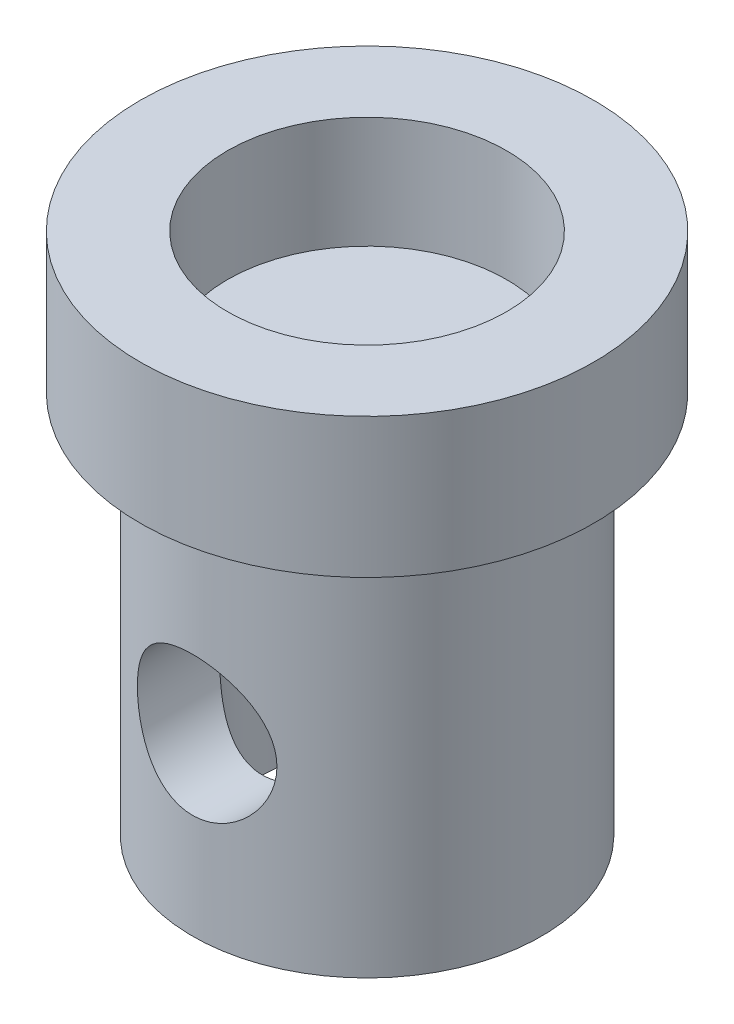
ISO-10303-21;
HEADER;
FILE_DESCRIPTION(('STEP AP214'),'2;1');
FILE_NAME('part.step','',(''),(''),'','','');
FILE_SCHEMA(('AUTOMOTIVE_DESIGN { 1 0 10303 214 1 1 1 1 }'));
ENDSEC;
DATA;
#1=APPLICATION_CONTEXT('core data for automotive mechanical design processes');
#2=APPLICATION_PROTOCOL_DEFINITION('international standard','automotive_design',2000,#1);
#3=PRODUCT_CONTEXT('',#1,'mechanical');
#4=PRODUCT('Part','Part','',(#3));
#5=PRODUCT_RELATED_PRODUCT_CATEGORY('part','',(#4));
#6=PRODUCT_DEFINITION_FORMATION('','',#4);
#7=PRODUCT_DEFINITION_CONTEXT('part definition',#1,'design');
#8=PRODUCT_DEFINITION('design','',#6,#7);
#9=PRODUCT_DEFINITION_SHAPE('','',#8);
#10=(LENGTH_UNIT() NAMED_UNIT(*) SI_UNIT(.MILLI.,.METRE.));
#11=(NAMED_UNIT(*) PLANE_ANGLE_UNIT() SI_UNIT($,.RADIAN.));
#12=(NAMED_UNIT(*) SI_UNIT($,.STERADIAN.) SOLID_ANGLE_UNIT());
#13=UNCERTAINTY_MEASURE_WITH_UNIT(LENGTH_MEASURE(1.E-05),#10,'distance_accuracy_value','');
#14=(GEOMETRIC_REPRESENTATION_CONTEXT(3) GLOBAL_UNCERTAINTY_ASSIGNED_CONTEXT((#13)) GLOBAL_UNIT_ASSIGNED_CONTEXT((#10,
#11,#12)) REPRESENTATION_CONTEXT('',''));
#15=CARTESIAN_POINT('',(0.,0.,0.));
#16=DIRECTION('',(0.,0.,1.));
#17=DIRECTION('',(1.,0.,0.));
#18=AXIS2_PLACEMENT_3D('',#15,#16,#17);
#19=CARTESIAN_POINT('',(6.5,11.,0.));
#20=DIRECTION('',(0.,1.,0.));
#21=DIRECTION('',(-1.,0.,0.));
#22=AXIS2_PLACEMENT_3D('',#19,#20,#21);
#23=PLANE('',#22);
#24=CARTESIAN_POINT('',(0.,11.,0.));
#25=DIRECTION('',(0.,1.,0.));
#26=DIRECTION('',(-1.,0.,0.));
#27=AXIS2_PLACEMENT_3D('',#24,#25,#26);
#28=CIRCLE('',#27,6.5);
#29=CARTESIAN_POINT('',(-6.5,11.,0.));
#30=VERTEX_POINT('',#29);
#31=EDGE_CURVE('E128',#30,#30,#28,.T.);
#32=ORIENTED_EDGE('',*,*,#31,.F.);
#33=EDGE_LOOP('',(#32));
#34=FACE_BOUND('',#33,.T.);
#35=CARTESIAN_POINT('',(0.,11.,0.));
#36=DIRECTION('',(0.,1.,0.));
#37=DIRECTION('',(-1.,0.,0.));
#38=AXIS2_PLACEMENT_3D('',#35,#36,#37);
#39=CIRCLE('',#38,6.);
#40=CARTESIAN_POINT('',(-6.,11.,0.));
#41=VERTEX_POINT('',#40);
#42=EDGE_CURVE('E10',#41,#41,#39,.T.);
#43=ORIENTED_EDGE('',*,*,#42,.T.);
#44=EDGE_LOOP('',(#43));
#45=FACE_BOUND('',#44,.T.);
#46=ADVANCED_FACE('F39',(#34,#45),#23,.F.);
#47=CARTESIAN_POINT('',(0.,9.99999999999998,0.));
#48=DIRECTION('',(0.,1.,0.));
#49=DIRECTION('',(-1.,0.,0.));
#50=AXIS2_PLACEMENT_3D('',#47,#48,#49);
#51=TOROIDAL_SURFACE('',#50,6.,1.);
#52=ORIENTED_EDGE('',*,*,#42,.F.);
#53=EDGE_LOOP('',(#52));
#54=FACE_BOUND('',#53,.T.);
#55=CARTESIAN_POINT('',(0.,9.99999999999998,0.));
#56=DIRECTION('',(0.,1.,0.));
#57=DIRECTION('',(-1.,0.,0.));
#58=AXIS2_PLACEMENT_3D('',#55,#56,#57);
#59=CIRCLE('',#58,5.);
#60=CARTESIAN_POINT('',(-5.,9.99999999999997,0.));
#61=VERTEX_POINT('',#60);
#62=EDGE_CURVE('E51',#61,#61,#59,.T.);
#63=ORIENTED_EDGE('',*,*,#62,.T.);
#64=EDGE_LOOP('',(#63));
#65=FACE_BOUND('',#64,.T.);
#66=ADVANCED_FACE('F96',(#54,#65),#51,.F.);
#67=CARTESIAN_POINT('',(0.,11.8,0.));
#68=DIRECTION('',(0.,1.,0.));
#69=DIRECTION('',(-1.,0.,0.));
#70=AXIS2_PLACEMENT_3D('',#67,#68,#69);
#71=CYLINDRICAL_SURFACE('',#70,4.99999999999999);
#72=CARTESIAN_POINT('',(2.,4.99999999999997,-4.58257569495583));
#73=CARTESIAN_POINT('',(1.99999540068022,5.10712368971293,-4.58258022779736));
#74=CARTESIAN_POINT('',(1.99134173553407,5.21442629433182,-4.58638433797122));
#75=CARTESIAN_POINT('',(1.95706710874823,5.42593908409955,-4.60111083306599));
#76=CARTESIAN_POINT('',(1.93140279032341,5.53014065433849,-4.61205140628346));
#77=CARTESIAN_POINT('',(1.86423554476216,5.7320518089708,-4.63960410719221));
#78=CARTESIAN_POINT('',(1.82279228998551,5.82978424329119,-4.65619484260881));
#79=CARTESIAN_POINT('',(1.72542013194152,6.01688535486227,-4.69314677188872));
#80=CARTESIAN_POINT('',(1.66949439157707,6.10625585252408,-4.7135071422061));
#81=CARTESIAN_POINT('',(1.54132201423254,6.27926031454431,-4.75700861562335));
#82=CARTESIAN_POINT('',(1.46837936836551,6.36235639939722,-4.78023917022605));
#83=CARTESIAN_POINT('',(1.30970909513215,6.51552902085578,-4.82612457915276));
#84=CARTESIAN_POINT('',(1.22397701877347,6.58560100770968,-4.8487792299176));
#85=CARTESIAN_POINT('',(1.03800631337303,6.71340639030968,-4.89203407641394));
#86=CARTESIAN_POINT('',(0.937328966419094,6.77054429968591,-4.91251803612569));
#87=CARTESIAN_POINT('',(0.726825322068638,6.86684357017376,-4.94803927702515));
#88=CARTESIAN_POINT('',(0.617002769076883,6.90601224624884,-4.96307877403248));
#89=CARTESIAN_POINT('',(0.396966427039754,6.96334148599306,-4.98538324990608));
#90=CARTESIAN_POINT('',(0.287028984858317,6.98242731397019,-4.99298936770627));
#91=CARTESIAN_POINT('',(0.0652663285839623,7.00202848578142,-5.00080310687429));
#92=CARTESIAN_POINT('',(-0.0465581658394108,7.00255075596577,-5.00101348770555));
#93=CARTESIAN_POINT('',(-0.262232494702088,6.98551723019577,-4.99421962820611));
#94=CARTESIAN_POINT('',(-0.366177452870456,6.96897522724526,-4.98761996771484));
#95=CARTESIAN_POINT('',(-0.569673109221913,6.920007123697,-4.9684929146914));
#96=CARTESIAN_POINT('',(-0.669223484391238,6.88757985760151,-4.9559650872134));
#97=CARTESIAN_POINT('',(-0.862897938510557,6.80736351712172,-4.92596824457465));
#98=CARTESIAN_POINT('',(-0.956917623378895,6.75935028518459,-4.90842760466222));
#99=CARTESIAN_POINT('',(-1.13580815074131,6.64953499308082,-4.87014585180273));
#100=CARTESIAN_POINT('',(-1.22067584271796,6.58772820689981,-4.84940364267148));
#101=CARTESIAN_POINT('',(-1.38476882799017,6.44735086405609,-4.80521637176121));
#102=CARTESIAN_POINT('',(-1.46325784526632,6.36794610742718,-4.78168326511757));
#103=CARTESIAN_POINT('',(-1.60610741539265,6.19700942816797,-4.73561660973261));
#104=CARTESIAN_POINT('',(-1.67046334378698,6.10547355180437,-4.71308339008075));
#105=CARTESIAN_POINT('',(-1.78490418871927,5.90958097762604,-4.67096897409021));
#106=CARTESIAN_POINT('',(-1.83453465163626,5.80493516966132,-4.65148914057706));
#107=CARTESIAN_POINT('',(-1.91517625986646,5.58778450968775,-4.61887590344083));
#108=CARTESIAN_POINT('',(-1.94619949837798,5.47528481527339,-4.60573837891309));
#109=CARTESIAN_POINT('',(-1.9869549488549,5.25296422253254,-4.58829759702714));
#110=CARTESIAN_POINT('',(-1.99787209681454,5.14339955287142,-4.58350366456136));
#111=CARTESIAN_POINT('',(-2.00156132644289,4.92392279224042,-4.58189497869036));
#112=CARTESIAN_POINT('',(-1.99433891059128,4.81401081672432,-4.5850778056036));
#113=CARTESIAN_POINT('',(-1.96303289479003,4.60354106504303,-4.59856044359111));
#114=CARTESIAN_POINT('',(-1.93993306202386,4.50280706259991,-4.60844457798299));
#115=CARTESIAN_POINT('',(-1.87880418691087,4.30671159521452,-4.63370051027338));
#116=CARTESIAN_POINT('',(-1.84077183430228,4.21135132689282,-4.64907352488596));
#117=CARTESIAN_POINT('',(-1.74913563948157,4.02439764220432,-4.68433781860099));
#118=CARTESIAN_POINT('',(-1.69496286826465,3.93311381130544,-4.70438704639175));
#119=CARTESIAN_POINT('',(-1.57316522444182,3.76051701255839,-4.74650385157793));
#120=CARTESIAN_POINT('',(-1.5055348734819,3.67920812720453,-4.76857224896043));
#121=CARTESIAN_POINT('',(-1.35284421168058,3.52262659140061,-4.81420915971414));
#122=CARTESIAN_POINT('',(-1.26686542944544,3.44824343470838,-4.83776807285231));
#123=CARTESIAN_POINT('',(-1.08308363336851,3.3148229233902,-4.8821979456753));
#124=CARTESIAN_POINT('',(-0.985280138466612,3.25578619340485,-4.90306879593134));
#125=CARTESIAN_POINT('',(-0.780279934003019,3.15495237353664,-4.93983715900388));
#126=CARTESIAN_POINT('',(-0.67308548099875,3.11315115582631,-4.95573586240659));
#127=CARTESIAN_POINT('',(-0.452393590914552,3.04845114760022,-4.98072713468902));
#128=CARTESIAN_POINT('',(-0.338899610276824,3.02554209858928,-4.98982339706102));
#129=CARTESIAN_POINT('',(-0.116816510362619,3.00049529834713,-4.99979008211857));
#130=CARTESIAN_POINT('',(-0.00839049265209018,2.99709987143795,-5.00115846749744));
#131=CARTESIAN_POINT('',(0.207433835792263,3.00785547938344,-4.9968604237372));
#132=CARTESIAN_POINT('',(0.314832299614384,3.02200385815555,-4.99119505948773));
#133=CARTESIAN_POINT('',(0.522170901733395,3.06654678799986,-4.97371513381835));
#134=CARTESIAN_POINT('',(0.622238803864866,3.09642894475653,-4.96209480698997));
#135=CARTESIAN_POINT('',(0.815922355542601,3.17105280588104,-4.93394947767357));
#136=CARTESIAN_POINT('',(0.909536811189119,3.21579725093907,-4.91742357062858));
#137=CARTESIAN_POINT('',(1.09220303880515,3.3211031933532,-4.88018094611866));
#138=CARTESIAN_POINT('',(1.18087037518738,3.38227627532511,-4.85931130687199));
#139=CARTESIAN_POINT('',(1.34705404014793,3.51778853874697,-4.81589402227079));
#140=CARTESIAN_POINT('',(1.42456572919735,3.59213316960819,-4.79334568464252));
#141=CARTESIAN_POINT('',(1.57120121894449,3.75731514684863,-4.74737767367679));
#142=CARTESIAN_POINT('',(1.63950871002775,3.84888857514407,-4.72399047228095));
#143=CARTESIAN_POINT('',(1.75984762763149,4.0429424357208,-4.68049656850749));
#144=CARTESIAN_POINT('',(1.81187714055767,4.14542414845351,-4.66039025195448));
#145=CARTESIAN_POINT('',(1.89399048451634,4.34903618647017,-4.62758914239063));
#146=CARTESIAN_POINT('',(1.92562535665267,4.44946160271241,-4.61439096680414));
#147=CARTESIAN_POINT('',(1.97271990928489,4.65448904149261,-4.59445826034119));
#148=CARTESIAN_POINT('',(1.98822466191608,4.75907857342432,-4.58770572290434));
#149=CARTESIAN_POINT('',(1.99692202185513,4.88677823911149,-4.58391763942089));
#150=CARTESIAN_POINT('',(1.99807530751895,4.9094014803564,-4.58341531117283));
#151=CARTESIAN_POINT('',(1.9996148112425,4.9546804767972,-4.58274384722722));
#152=CARTESIAN_POINT('',(2.0000009730612,4.97733623425513,-4.58257473595919));
#153=CARTESIAN_POINT('',(2.,4.99999999999997,-4.58257569495583));
#154=B_SPLINE_CURVE_WITH_KNOTS('',3,(#72,#73,#74,#75,#76,#77,#78,#79,#80,#81,#82,#83,#84,#85,
#86,#87,#88,#89,#90,#91,#92,#93,#94,#95,#96,#97,#98,#99,#100,#101,#102,#103,#104,#105,#106,#107,
#108,#109,#110,#111,#112,#113,#114,#115,#116,#117,#118,#119,#120,#121,#122,#123,#124,#125,#126,
#127,#128,#129,#130,#131,#132,#133,#134,#135,#136,#137,#138,#139,#140,#141,#142,#143,#144,#145,
#146,#147,#148,#149,#150,#151,#152,#153),.UNSPECIFIED.,.T.,.F.,(4,2,2,2,2,2,2,2,2,2,2,2,2,2,2,2,
2,2,2,2,2,2,2,2,2,2,2,2,2,2,2,2,2,2,2,2,2,2,2,2,4),(0.,0.321277648767654,0.643377335822245,
0.96427082329339,1.28509428823861,1.62255618284425,1.96013574348342,2.31102669091428,
2.6617746696948,2.99554182887183,3.32918445305672,3.64408644830302,3.95901155129059,
4.27868300234898,4.59846414940031,4.93924044081355,5.28012807127127,5.63064458717257,
5.98093304800101,6.3098214752442,6.63861014907939,6.94867248085145,7.25880358651638,
7.58151154652701,7.90435114525849,8.25103734246979,8.59773764852748,8.94435487312812,
9.29078375954136,9.61461039755953,9.93838801512602,10.2522199444335,10.5661097782859,
10.8938705113993,11.2217671656421,11.5699625328561,11.9181988175919,12.2351666081908,
12.5512463021924,12.619212852096,12.6871843847256),.UNSPECIFIED.);
#155=CARTESIAN_POINT('',(2.,4.99999999999997,-4.58257569495583));
#156=VERTEX_POINT('',#155);
#157=EDGE_CURVE('E87',#156,#156,#154,.T.);
#158=ORIENTED_EDGE('',*,*,#157,.T.);
#159=EDGE_LOOP('',(#158));
#160=FACE_BOUND('',#159,.T.);
#161=CARTESIAN_POINT('',(2.,4.99999999999997,4.58257569495583));
#162=CARTESIAN_POINT('',(1.99999540068022,4.89287631028701,4.58258022779736));
#163=CARTESIAN_POINT('',(1.99134173553407,4.78557370566813,4.58638433797122));
#164=CARTESIAN_POINT('',(1.95706710874823,4.5740609159004,4.60111083306599));
#165=CARTESIAN_POINT('',(1.93140279032341,4.46985934566145,4.61205140628346));
#166=CARTESIAN_POINT('',(1.86423554476215,4.26794819102915,4.63960410719221));
#167=CARTESIAN_POINT('',(1.82279228998551,4.17021575670875,4.65619484260881));
#168=CARTESIAN_POINT('',(1.72542013194152,3.98311464513767,4.69314677188873));
#169=CARTESIAN_POINT('',(1.66949439157707,3.89374414747587,4.71350714220611));
#170=CARTESIAN_POINT('',(1.54132201423254,3.72073968545564,4.75700861562335));
#171=CARTESIAN_POINT('',(1.46837936836551,3.63764360060273,4.78023917022605));
#172=CARTESIAN_POINT('',(1.30970909513215,3.48447097914417,4.82612457915277));
#173=CARTESIAN_POINT('',(1.22397701877347,3.41439899229027,4.84877922991761));
#174=CARTESIAN_POINT('',(1.03800631337303,3.28659360969026,4.89203407641394));
#175=CARTESIAN_POINT('',(0.937328966419091,3.22945570031403,4.91251803612569));
#176=CARTESIAN_POINT('',(0.726825322068635,3.13315642982618,4.94803927702515));
#177=CARTESIAN_POINT('',(0.61700276907688,3.09398775375111,4.96307877403248));
#178=CARTESIAN_POINT('',(0.396966427039751,3.03665851400689,4.98538324990608));
#179=CARTESIAN_POINT('',(0.287028984858314,3.01757268602975,4.99298936770627));
#180=CARTESIAN_POINT('',(0.0652663285839602,2.99797151421852,5.00080310687429));
#181=CARTESIAN_POINT('',(-0.0465581658394127,2.99744924403418,5.00101348770555));
#182=CARTESIAN_POINT('',(-0.26223249470209,3.01448276980417,4.99421962820611));
#183=CARTESIAN_POINT('',(-0.366177452870458,3.03102477275469,4.98761996771484));
#184=CARTESIAN_POINT('',(-0.569673109221914,3.07999287630294,4.9684929146914));
#185=CARTESIAN_POINT('',(-0.669223484391239,3.11242014239844,4.9559650872134));
#186=CARTESIAN_POINT('',(-0.862897938510558,3.19263648287823,4.92596824457465));
#187=CARTESIAN_POINT('',(-0.956917623378896,3.24064971481536,4.90842760466222));
#188=CARTESIAN_POINT('',(-1.13580815074131,3.35046500691913,4.87014585180273));
#189=CARTESIAN_POINT('',(-1.22067584271796,3.41227179310014,4.84940364267147));
#190=CARTESIAN_POINT('',(-1.38476882799018,3.55264913594386,4.80521637176121));
#191=CARTESIAN_POINT('',(-1.46325784526632,3.63205389257277,4.78168326511757));
#192=CARTESIAN_POINT('',(-1.60610741539265,3.80299057183198,4.73561660973261));
#193=CARTESIAN_POINT('',(-1.67046334378698,3.89452644819558,4.71308339008074));
#194=CARTESIAN_POINT('',(-1.78490418871927,4.09041902237391,4.67096897409021));
#195=CARTESIAN_POINT('',(-1.83453465163626,4.19506483033862,4.65148914057706));
#196=CARTESIAN_POINT('',(-1.91517625986646,4.41221549031219,4.61887590344082));
#197=CARTESIAN_POINT('',(-1.94619949837798,4.52471518472656,4.60573837891309));
#198=CARTESIAN_POINT('',(-1.9869549488549,4.74703577746741,4.58829759702714));
#199=CARTESIAN_POINT('',(-1.99787209681454,4.85660044712853,4.58350366456136));
#200=CARTESIAN_POINT('',(-2.00156132644289,5.07607720775953,4.58189497869037));
#201=CARTESIAN_POINT('',(-1.99433891059128,5.18598918327563,4.5850778056036));
#202=CARTESIAN_POINT('',(-1.96303289479003,5.39645893495692,4.59856044359111));
#203=CARTESIAN_POINT('',(-1.93993306202386,5.49719293740004,4.608444577983));
#204=CARTESIAN_POINT('',(-1.87880418691087,5.69328840478543,4.63370051027338));
#205=CARTESIAN_POINT('',(-1.84077183430228,5.78864867310712,4.64907352488596));
#206=CARTESIAN_POINT('',(-1.74913563948157,5.97560235779563,4.684337818601));
#207=CARTESIAN_POINT('',(-1.69496286826465,6.06688618869451,4.70438704639176));
#208=CARTESIAN_POINT('',(-1.57316522444182,6.23948298744156,4.74650385157793));
#209=CARTESIAN_POINT('',(-1.50553487348189,6.32079187279542,4.76857224896043));
#210=CARTESIAN_POINT('',(-1.35284421168058,6.47737340859934,4.81420915971415));
#211=CARTESIAN_POINT('',(-1.26686542944544,6.55175656529157,4.83776807285232));
#212=CARTESIAN_POINT('',(-1.08308363336851,6.68517707660974,4.8821979456753));
#213=CARTESIAN_POINT('',(-0.985280138466608,6.74421380659509,4.90306879593134));
#214=CARTESIAN_POINT('',(-0.780279934003015,6.84504762646331,4.93983715900388));
#215=CARTESIAN_POINT('',(-0.673085480998745,6.88684884417364,4.95573586240659));
#216=CARTESIAN_POINT('',(-0.452393590914548,6.95154885239973,4.98072713468903));
#217=CARTESIAN_POINT('',(-0.33889961027682,6.97445790141066,4.98982339706102));
#218=CARTESIAN_POINT('',(-0.116816510362616,6.99950470165282,4.99979008211857));
#219=CARTESIAN_POINT('',(-0.00839049265208748,7.002900128562,5.00115846749744));
#220=CARTESIAN_POINT('',(0.207433835792265,6.99214452061651,4.9968604237372));
#221=CARTESIAN_POINT('',(0.314832299614386,6.97799614184439,4.99119505948773));
#222=CARTESIAN_POINT('',(0.522170901733396,6.93345321200009,4.97371513381835));
#223=CARTESIAN_POINT('',(0.622238803864867,6.90357105524342,4.96209480698997));
#224=CARTESIAN_POINT('',(0.815922355542602,6.8289471941189,4.93394947767357));
#225=CARTESIAN_POINT('',(0.909536811189121,6.78420274906088,4.91742357062858));
#226=CARTESIAN_POINT('',(1.09220303880515,6.67889680664674,4.88018094611866));
#227=CARTESIAN_POINT('',(1.18087037518738,6.61772372467484,4.85931130687199));
#228=CARTESIAN_POINT('',(1.34705404014793,6.48221146125298,4.81589402227079));
#229=CARTESIAN_POINT('',(1.42456572919735,6.40786683039176,4.79334568464252));
#230=CARTESIAN_POINT('',(1.57120121894449,6.24268485315132,4.74737767367679));
#231=CARTESIAN_POINT('',(1.63950871002775,6.15111142485588,4.72399047228095));
#232=CARTESIAN_POINT('',(1.75984762763149,5.95705756427915,4.68049656850748));
#233=CARTESIAN_POINT('',(1.81187714055767,5.85457585154643,4.66039025195447));
#234=CARTESIAN_POINT('',(1.89399048451634,5.65096381352978,4.62758914239063));
#235=CARTESIAN_POINT('',(1.92562535665267,5.55053839728753,4.61439096680414));
#236=CARTESIAN_POINT('',(1.97271990928489,5.34551095850733,4.59445826034119));
#237=CARTESIAN_POINT('',(1.98822466191608,5.24092142657562,4.58770572290434));
#238=CARTESIAN_POINT('',(1.99692202185513,5.11322176088845,4.58391763942089));
#239=CARTESIAN_POINT('',(1.99807530751895,5.09059851964354,4.58341531117283));
#240=CARTESIAN_POINT('',(1.9996148112425,5.04531952320275,4.58274384722722));
#241=CARTESIAN_POINT('',(2.0000009730612,5.02266376574481,4.58257473595919));
#242=CARTESIAN_POINT('',(2.,4.99999999999997,4.58257569495583));
#243=B_SPLINE_CURVE_WITH_KNOTS('',3,(#161,#162,#163,#164,#165,#166,#167,#168,#169,#170,#171,
#172,#173,#174,#175,#176,#177,#178,#179,#180,#181,#182,#183,#184,#185,#186,#187,#188,#189,#190,
#191,#192,#193,#194,#195,#196,#197,#198,#199,#200,#201,#202,#203,#204,#205,#206,#207,#208,#209,
#210,#211,#212,#213,#214,#215,#216,#217,#218,#219,#220,#221,#222,#223,#224,#225,#226,#227,#228,
#229,#230,#231,#232,#233,#234,#235,#236,#237,#238,#239,#240,#241,#242),.UNSPECIFIED.,.T.,.F.,(4,
2,2,2,2,2,2,2,2,2,2,2,2,2,2,2,2,2,2,2,2,2,2,2,2,2,2,2,2,2,2,2,2,2,2,2,2,2,2,2,4),(0.,
0.321277648767654,0.643377335822246,0.964270823293392,1.28509428823862,1.62255618284425,
1.96013574348342,2.31102669091428,2.6617746696948,2.99554182887184,3.32918445305672,
3.64408644830302,3.95901155129059,4.27868300234898,4.59846414940031,4.93924044081356,
5.28012807127127,5.63064458717257,5.98093304800101,6.30982147524421,6.63861014907939,
6.94867248085145,7.25880358651638,7.58151154652701,7.90435114525849,8.25103734246979,
8.59773764852748,8.94435487312812,9.29078375954136,9.61461039755953,9.93838801512602,
10.2522199444335,10.5661097782859,10.8938705113993,11.2217671656421,11.5699625328561,
11.9181988175919,12.2351666081908,12.5512463021924,12.619212852096,12.6871843847256),.UNSPECIFIED.);
#244=CARTESIAN_POINT('',(2.,4.99999999999997,4.58257569495583));
#245=VERTEX_POINT('',#244);
#246=EDGE_CURVE('E81',#245,#245,#243,.T.);
#247=ORIENTED_EDGE('',*,*,#246,.T.);
#248=EDGE_LOOP('',(#247));
#249=FACE_BOUND('',#248,.T.);
#250=ORIENTED_EDGE('',*,*,#62,.F.);
#251=EDGE_LOOP('',(#250));
#252=FACE_BOUND('',#251,.T.);
#253=CARTESIAN_POINT('',(0.,0.,0.));
#254=DIRECTION('',(0.,1.,0.));
#255=DIRECTION('',(-1.,0.,0.));
#256=AXIS2_PLACEMENT_3D('',#253,#254,#255);
#257=CIRCLE('',#256,4.99999999999998);
#258=CARTESIAN_POINT('',(-4.99999999999995,0.,0.));
#259=VERTEX_POINT('',#258);
#260=EDGE_CURVE('E56',#259,#259,#257,.T.);
#261=ORIENTED_EDGE('',*,*,#260,.T.);
#262=EDGE_LOOP('',(#261));
#263=FACE_BOUND('',#262,.T.);
#264=ADVANCED_FACE('F92',(#160,#249,#252,#263),#71,.T.);
#265=CARTESIAN_POINT('',(5.,0.,0.));
#266=DIRECTION('',(0.,1.,0.));
#267=DIRECTION('',(-1.,0.,0.));
#268=AXIS2_PLACEMENT_3D('',#265,#266,#267);
#269=PLANE('',#268);
#270=ORIENTED_EDGE('',*,*,#260,.F.);
#271=EDGE_LOOP('',(#270));
#272=FACE_BOUND('',#271,.T.);
#273=CARTESIAN_POINT('',(0.,0.,0.));
#274=DIRECTION('',(0.,1.,0.));
#275=DIRECTION('',(-1.,0.,0.));
#276=AXIS2_PLACEMENT_3D('',#273,#274,#275);
#277=CIRCLE('',#276,2.99999999999997);
#278=CARTESIAN_POINT('',(-2.99999999999995,0.,0.));
#279=VERTEX_POINT('',#278);
#280=EDGE_CURVE('E113',#279,#279,#277,.T.);
#281=ORIENTED_EDGE('',*,*,#280,.T.);
#282=EDGE_LOOP('',(#281));
#283=FACE_BOUND('',#282,.T.);
#284=ADVANCED_FACE('F95',(#272,#283),#269,.F.);
#285=CARTESIAN_POINT('',(0.,11.8,0.));
#286=DIRECTION('',(0.,1.,0.));
#287=DIRECTION('',(-1.,0.,0.));
#288=AXIS2_PLACEMENT_3D('',#285,#286,#287);
#289=CYLINDRICAL_SURFACE('',#288,2.99999999999999);
#290=CARTESIAN_POINT('',(2.,4.99999999999997,-2.23606797749978));
#291=CARTESIAN_POINT('',(1.99999453997731,4.90237168913135,-2.23607753462816));
#292=CARTESIAN_POINT('',(1.99278992503664,4.80470924629117,-2.24258071047441));
#293=CARTESIAN_POINT('',(1.96458268317731,4.61288008834916,-2.26731972501616));
#294=CARTESIAN_POINT('',(1.94355530587862,4.51871996447041,-2.2855766081271));
#295=CARTESIAN_POINT('',(1.88935861676632,4.33726455812229,-2.33056585825569));
#296=CARTESIAN_POINT('',(1.85630718014214,4.24991230326231,-2.35721561794601));
#297=CARTESIAN_POINT('',(1.77934008393538,4.08213416765331,-2.41584094681825));
#298=CARTESIAN_POINT('',(1.73542216812163,4.0017097300235,-2.4478176215883));
#299=CARTESIAN_POINT('',(1.63002410007713,3.83635311238306,-2.51946072932025));
#300=CARTESIAN_POINT('',(1.56687435451732,3.75266788228277,-2.55954936090363));
#301=CARTESIAN_POINT('',(1.42819219740679,3.59599729112569,-2.63944827308082));
#302=CARTESIAN_POINT('',(1.3526477317708,3.52302247834144,-2.67925824297984));
#303=CARTESIAN_POINT('',(1.17815690494295,3.3793563412183,-2.76088818523746));
#304=CARTESIAN_POINT('',(1.07740643965818,3.3105174882243,-2.80216785846922));
#305=CARTESIAN_POINT('',(0.862470964212226,3.1913579045099,-2.87558484482763));
#306=CARTESIAN_POINT('',(0.748301152321697,3.14101648596878,-2.90773236231036));
#307=CARTESIAN_POINT('',(0.523249073479996,3.06644359898252,-2.95599907464724));
#308=CARTESIAN_POINT('',(0.41343472518141,3.03991665550441,-2.97351175615866));
#309=CARTESIAN_POINT('',(0.189695448729857,3.00581551071633,-2.9960974546192));
#310=CARTESIAN_POINT('',(0.0757758812858207,2.99821744077453,-3.00118613762358));
#311=CARTESIAN_POINT('',(-0.134147050232333,3.00217244994902,-2.99855361722951));
#312=CARTESIAN_POINT('',(-0.230240638008756,3.01098905131703,-2.99266264910126));
#313=CARTESIAN_POINT('',(-0.419238633271018,3.04209105135888,-2.97208182790019));
#314=CARTESIAN_POINT('',(-0.512142807649725,3.06437743230352,-2.957391333131));
#315=CARTESIAN_POINT('',(-0.69207793767117,3.12119568479455,-2.92052091703734));
#316=CARTESIAN_POINT('',(-0.779130623845962,3.15567888519853,-2.89837077982677));
#317=CARTESIAN_POINT('',(-0.946209150653557,3.23555364295279,-2.84821104476285));
#318=CARTESIAN_POINT('',(-1.0262337049694,3.28094719150149,-2.82020037745159));
#319=CARTESIAN_POINT('',(-1.18828429196344,3.38797873745987,-2.756180584507));
#320=CARTESIAN_POINT('',(-1.26919148099708,3.45096752335276,-2.71960408792022));
#321=CARTESIAN_POINT('',(-1.41998807498305,3.5878986794803,-2.64400601826995));
#322=CARTESIAN_POINT('',(-1.48986013519457,3.66185794593379,-2.60498072815229));
#323=CARTESIAN_POINT('',(-1.62772235326165,3.83196321021327,-2.52150044944149));
#324=CARTESIAN_POINT('',(-1.69373593126354,3.92977107971446,-2.47714320008929));
#325=CARTESIAN_POINT('',(-1.80834874945483,4.13750983922069,-2.39475610831092));
#326=CARTESIAN_POINT('',(-1.85697718654898,4.24741999441387,-2.35671571534886));
#327=CARTESIAN_POINT('',(-1.92332724567776,4.44471906207308,-2.30262870306886));
#328=CARTESIAN_POINT('',(-1.94590791747533,4.52959337005685,-2.28340364577664));
#329=CARTESIAN_POINT('',(-1.97979555580014,4.70303948981681,-2.25409039789609));
#330=CARTESIAN_POINT('',(-1.99112206964395,4.79160461117259,-2.24398636782351));
#331=CARTESIAN_POINT('',(-2.00179400148877,4.97044298644147,-2.23447556987369));
#332=CARTESIAN_POINT('',(-2.00108729753098,5.06072197852009,-2.23511533866466));
#333=CARTESIAN_POINT('',(-1.98761629716365,5.23968383395501,-2.24709880368949));
#334=CARTESIAN_POINT('',(-1.97484222690381,5.32836534410735,-2.25845117648847));
#335=CARTESIAN_POINT('',(-1.93899811187046,5.4973894175498,-2.28927977500743));
#336=CARTESIAN_POINT('',(-1.91646174529973,5.57792770900254,-2.30833187069746));
#337=CARTESIAN_POINT('',(-1.86223041628513,5.73412623605026,-2.35229958533647));
#338=CARTESIAN_POINT('',(-1.83053237805352,5.80978482296298,-2.37721717294627));
#339=CARTESIAN_POINT('',(-1.75163346599564,5.97020200384748,-2.43611483596191));
#340=CARTESIAN_POINT('',(-1.70260028818247,6.05375681154266,-2.47091081434313));
#341=CARTESIAN_POINT('',(-1.59352731501439,6.21241680261725,-2.54262514806631));
#342=CARTESIAN_POINT('',(-1.53347411883828,6.28751151674241,-2.5795460494754));
#343=CARTESIAN_POINT('',(-1.38876657712436,6.4439623474675,-2.66075678321004));
#344=CARTESIAN_POINT('',(-1.30160386514208,6.52310284824828,-2.70489452138571));
#345=CARTESIAN_POINT('',(-1.1130994886622,6.66581668294026,-2.78775581841635));
#346=CARTESIAN_POINT('',(-1.01177047745702,6.72940377125669,-2.82648414789455));
#347=CARTESIAN_POINT('',(-0.817487474821809,6.82789173891756,-2.8879082124222));
#348=CARTESIAN_POINT('',(-0.726662364886333,6.86595650444033,-2.91225458111006));
#349=CARTESIAN_POINT('',(-0.538757079020527,6.92860719432041,-2.95278707867039));
#350=CARTESIAN_POINT('',(-0.441682263858782,6.95320450285974,-2.96898009871991));
#351=CARTESIAN_POINT('',(-0.243369392303455,6.98769696383873,-2.99178364026744));
#352=CARTESIAN_POINT('',(-0.14211483692433,6.99752667950665,-2.99835150856531));
#353=CARTESIAN_POINT('',(0.0608555465807203,7.00164785141708,-3.00109821029054));
#354=CARTESIAN_POINT('',(0.162571330953436,6.99594075195615,-2.997278009389));
#355=CARTESIAN_POINT('',(0.355757532528096,6.97034051099527,-2.98029555977322));
#356=CARTESIAN_POINT('',(0.44743514307052,6.95150901513817,-2.96783277209855));
#357=CARTESIAN_POINT('',(0.626018422997053,6.90176199056908,-2.93536106206932));
#358=CARTESIAN_POINT('',(0.71292334868688,6.87084458465271,-2.91535096747102));
#359=CARTESIAN_POINT('',(0.885147296608341,6.79606129511595,-2.86791765486193));
#360=CARTESIAN_POINT('',(0.970083589200256,6.7515496925049,-2.84013248946337));
#361=CARTESIAN_POINT('',(1.13155266268317,6.65184935537399,-2.77975408235471));
#362=CARTESIAN_POINT('',(1.20808037205001,6.59665423204798,-2.74715796645263));
#363=CARTESIAN_POINT('',(1.36329422201401,6.46737109766367,-2.67392931472394));
#364=CARTESIAN_POINT('',(1.4404267952609,6.39167697632594,-2.63283913877369));
#365=CARTESIAN_POINT('',(1.58160022281595,6.22888645845414,-2.55053357649486));
#366=CARTESIAN_POINT('',(1.64563128323922,6.14178161116589,-2.50931811970154));
#367=CARTESIAN_POINT('',(1.7551325351841,5.96413240924469,-2.43384213590298));
#368=CARTESIAN_POINT('',(1.80164646897209,5.87435819004964,-2.39929086741903));
#369=CARTESIAN_POINT('',(1.88115802340272,5.68671555100683,-2.33747501591022));
#370=CARTESIAN_POINT('',(1.91418190281333,5.58886330613783,-2.31019631295304));
#371=CARTESIAN_POINT('',(1.95936262470908,5.40922853157543,-2.27191051929539));
#372=CARTESIAN_POINT('',(1.97452228373248,5.32869176320968,-2.25863695410151));
#373=CARTESIAN_POINT('',(1.99483915818926,5.16544359949544,-2.24071519216008));
#374=CARTESIAN_POINT('',(2.00000462703715,5.0827340557394,-2.23605987841475));
#375=CARTESIAN_POINT('',(2.,4.99999999999997,-2.23606797749978));
#376=B_SPLINE_CURVE_WITH_KNOTS('',3,(#290,#291,#292,#293,#294,#295,#296,#297,#298,#299,#300,
#301,#302,#303,#304,#305,#306,#307,#308,#309,#310,#311,#312,#313,#314,#315,#316,#317,#318,#319,
#320,#321,#322,#323,#324,#325,#326,#327,#328,#329,#330,#331,#332,#333,#334,#335,#336,#337,#338,
#339,#340,#341,#342,#343,#344,#345,#346,#347,#348,#349,#350,#351,#352,#353,#354,#355,#356,#357,
#358,#359,#360,#361,#362,#363,#364,#365,#366,#367,#368,#369,#370,#371,#372,#373,#374,#375),
.UNSPECIFIED.,.T.,.F.,(4,2,2,2,2,2,2,2,2,2,2,2,2,2,2,2,2,2,2,2,2,2,2,2,2,2,2,2,2,2,2,2,2,2,2,2,
2,2,2,2,2,2,4),(0.,0.292506930722154,0.58553904225929,0.875772651216277,1.16606657266549,
1.50154677068638,1.83735518436276,2.2216703100629,2.60555429388581,2.9463748206358,
3.28676536688298,3.57539534955742,3.86404638283746,4.15155831973191,4.43912276903,
4.76447525946635,5.09033414796639,5.46678703504944,5.84260469743949,6.11126090401325,
6.37944966235486,6.64880037638036,6.91836943570597,7.17476451706935,7.43124577644957,
7.73899230052351,8.04711556801508,8.42254684520962,8.7976449057258,9.10070580611698,
9.40351012888472,9.70765229266164,10.0117661844615,10.2937678224973,10.5758132789284,
10.874178629859,11.1727229593109,11.5182220628451,11.863978504186,12.1833412579672,
12.5020793664923,12.7501661630426,12.9980479966543),.UNSPECIFIED.);
#377=CARTESIAN_POINT('',(2.,4.99999999999997,-2.23606797749978));
#378=VERTEX_POINT('',#377);
#379=EDGE_CURVE('E42',#378,#378,#376,.T.);
#380=ORIENTED_EDGE('',*,*,#379,.T.);
#381=EDGE_LOOP('',(#380));
#382=FACE_BOUND('',#381,.T.);
#383=CARTESIAN_POINT('',(2.,4.99999999999997,2.23606797749978));
#384=CARTESIAN_POINT('',(1.99999453997731,5.09762831086859,2.23607753462816));
#385=CARTESIAN_POINT('',(1.99278992503664,5.19529075370877,2.24258071047441));
#386=CARTESIAN_POINT('',(1.96458268317731,5.38711991165079,2.26731972501616));
#387=CARTESIAN_POINT('',(1.94355530587862,5.48128003552954,2.2855766081271));
#388=CARTESIAN_POINT('',(1.88935861676632,5.66273544187766,2.33056585825569));
#389=CARTESIAN_POINT('',(1.85630718014214,5.75008769673763,2.35721561794601));
#390=CARTESIAN_POINT('',(1.77934008393538,5.91786583234664,2.41584094681824));
#391=CARTESIAN_POINT('',(1.73542216812163,5.99829026997645,2.4478176215883));
#392=CARTESIAN_POINT('',(1.63002410007714,6.16364688761688,2.51946072932025));
#393=CARTESIAN_POINT('',(1.56687435451732,6.24733211771717,2.55954936090363));
#394=CARTESIAN_POINT('',(1.4281921974068,6.40400270887426,2.63944827308082));
#395=CARTESIAN_POINT('',(1.3526477317708,6.4769775216585,2.67925824297984));
#396=CARTESIAN_POINT('',(1.17815690494296,6.62064365878164,2.76088818523746));
#397=CARTESIAN_POINT('',(1.07740643965819,6.68948251177564,2.80216785846921));
#398=CARTESIAN_POINT('',(0.862470964212233,6.80864209549005,2.87558484482763));
#399=CARTESIAN_POINT('',(0.748301152321705,6.85898351403116,2.90773236231035));
#400=CARTESIAN_POINT('',(0.523249073480005,6.93355640101742,2.95599907464724));
#401=CARTESIAN_POINT('',(0.413434725181418,6.96008334449553,2.97351175615866));
#402=CARTESIAN_POINT('',(0.189695448729864,6.99418448928362,2.9960974546192));
#403=CARTESIAN_POINT('',(0.0757758812858277,7.00178255922541,3.00118613762358));
#404=CARTESIAN_POINT('',(-0.134147050232327,6.99782755005092,2.99855361722951));
#405=CARTESIAN_POINT('',(-0.23024063800875,6.98901094868291,2.99266264910126));
#406=CARTESIAN_POINT('',(-0.419238633271012,6.95790894864107,2.97208182790019));
#407=CARTESIAN_POINT('',(-0.51214280764972,6.93562256769643,2.957391333131));
#408=CARTESIAN_POINT('',(-0.692077937671166,6.8788043152054,2.92052091703735));
#409=CARTESIAN_POINT('',(-0.779130623845958,6.84432111480142,2.89837077982677));
#410=CARTESIAN_POINT('',(-0.946209150653552,6.76444635704716,2.84821104476286));
#411=CARTESIAN_POINT('',(-1.0262337049694,6.71905280849846,2.8202003774516));
#412=CARTESIAN_POINT('',(-1.18828429196344,6.61202126254008,2.756180584507));
#413=CARTESIAN_POINT('',(-1.26919148099707,6.54903247664719,2.71960408792023));
#414=CARTESIAN_POINT('',(-1.41998807498304,6.41210132051966,2.64400601826996));
#415=CARTESIAN_POINT('',(-1.48986013519457,6.33814205406617,2.6049807281523));
#416=CARTESIAN_POINT('',(-1.62772235326165,6.16803678978669,2.52150044944149));
#417=CARTESIAN_POINT('',(-1.69373593126354,6.07022892028549,2.47714320008929));
#418=CARTESIAN_POINT('',(-1.80834874945482,5.86249016077927,2.39475610831093));
#419=CARTESIAN_POINT('',(-1.85697718654897,5.75258000558608,2.35671571534887));
#420=CARTESIAN_POINT('',(-1.92332724567775,5.55528093792688,2.30262870306886));
#421=CARTESIAN_POINT('',(-1.94590791747533,5.47040662994311,2.28340364577665));
#422=CARTESIAN_POINT('',(-1.97979555580014,5.29696051018314,2.25409039789609));
#423=CARTESIAN_POINT('',(-1.99112206964395,5.20839538882736,2.24398636782351));
#424=CARTESIAN_POINT('',(-2.00179400148877,5.02955701355849,2.23447556987369));
#425=CARTESIAN_POINT('',(-2.00108729753098,4.93927802147986,2.23511533866466));
#426=CARTESIAN_POINT('',(-1.98761629716365,4.76031616604494,2.24709880368949));
#427=CARTESIAN_POINT('',(-1.97484222690381,4.6716346558926,2.25845117648847));
#428=CARTESIAN_POINT('',(-1.93899811187046,4.50261058245015,2.28927977500743));
#429=CARTESIAN_POINT('',(-1.91646174529974,4.42207229099741,2.30833187069746));
#430=CARTESIAN_POINT('',(-1.86223041628514,4.26587376394969,2.35229958533647));
#431=CARTESIAN_POINT('',(-1.83053237805352,4.19021517703697,2.37721717294627));
#432=CARTESIAN_POINT('',(-1.75163346599564,4.02979799615247,2.4361148359619));
#433=CARTESIAN_POINT('',(-1.70260028818247,3.94624318845729,2.47091081434313));
#434=CARTESIAN_POINT('',(-1.5935273150144,3.7875831973827,2.5426251480663));
#435=CARTESIAN_POINT('',(-1.53347411883829,3.71248848325754,2.5795460494754));
#436=CARTESIAN_POINT('',(-1.38876657712437,3.55603765253245,2.66075678321004));
#437=CARTESIAN_POINT('',(-1.30160386514209,3.47689715175167,2.7048945213857));
#438=CARTESIAN_POINT('',(-1.11309948866221,3.3341833170597,2.78775581841635));
#439=CARTESIAN_POINT('',(-1.01177047745703,3.27059622874326,2.82648414789454));
#440=CARTESIAN_POINT('',(-0.817487474821821,3.17210826108239,2.88790821242219));
#441=CARTESIAN_POINT('',(-0.726662364886344,3.13404349555962,2.91225458111006));
#442=CARTESIAN_POINT('',(-0.538757079020539,3.07139280567954,2.95278707867039));
#443=CARTESIAN_POINT('',(-0.441682263858793,3.04679549714021,2.96898009871991));
#444=CARTESIAN_POINT('',(-0.243369392303467,3.01230303616122,2.99178364026744));
#445=CARTESIAN_POINT('',(-0.142114836924341,3.0024733204933,2.99835150856531));
#446=CARTESIAN_POINT('',(0.0608555465807105,2.99835214858287,3.00109821029054));
#447=CARTESIAN_POINT('',(0.162571330953427,3.0040592480438,2.997278009389));
#448=CARTESIAN_POINT('',(0.355757532528086,3.02965948900467,2.98029555977323));
#449=CARTESIAN_POINT('',(0.447435143070511,3.04849098486178,2.96783277209855));
#450=CARTESIAN_POINT('',(0.626018422997044,3.09823800943086,2.93536106206932));
#451=CARTESIAN_POINT('',(0.712923348686872,3.12915541534723,2.91535096747102));
#452=CARTESIAN_POINT('',(0.885147296608333,3.20393870488399,2.86791765486194));
#453=CARTESIAN_POINT('',(0.970083589200247,3.24845030749505,2.84013248946338));
#454=CARTESIAN_POINT('',(1.13155266268316,3.34815064462595,2.77975408235472));
#455=CARTESIAN_POINT('',(1.20808037205,3.40334576795196,2.74715796645263));
#456=CARTESIAN_POINT('',(1.363294222014,3.53262890233627,2.67392931472394));
#457=CARTESIAN_POINT('',(1.44042679526089,3.60832302367399,2.6328391387737));
#458=CARTESIAN_POINT('',(1.58160022281594,3.77111354154579,2.55053357649487));
#459=CARTESIAN_POINT('',(1.64563128323922,3.85821838883404,2.50931811970155));
#460=CARTESIAN_POINT('',(1.7551325351841,4.03586759075524,2.43384213590299));
#461=CARTESIAN_POINT('',(1.80164646897209,4.12564180995029,2.39929086741904));
#462=CARTESIAN_POINT('',(1.88115802340272,4.31328444899311,2.33747501591023));
#463=CARTESIAN_POINT('',(1.91418190281332,4.41113669386211,2.31019631295305));
#464=CARTESIAN_POINT('',(1.95936262470908,4.59077146842451,2.27191051929539));
#465=CARTESIAN_POINT('',(1.97452228373248,4.67130823679026,2.25863695410151));
#466=CARTESIAN_POINT('',(1.99483915818926,4.83455640050451,2.24071519216008));
#467=CARTESIAN_POINT('',(2.00000462703715,4.91726594426055,2.23605987841475));
#468=CARTESIAN_POINT('',(2.,4.99999999999997,2.23606797749978));
#469=B_SPLINE_CURVE_WITH_KNOTS('',3,(#383,#384,#385,#386,#387,#388,#389,#390,#391,#392,#393,
#394,#395,#396,#397,#398,#399,#400,#401,#402,#403,#404,#405,#406,#407,#408,#409,#410,#411,#412,
#413,#414,#415,#416,#417,#418,#419,#420,#421,#422,#423,#424,#425,#426,#427,#428,#429,#430,#431,
#432,#433,#434,#435,#436,#437,#438,#439,#440,#441,#442,#443,#444,#445,#446,#447,#448,#449,#450,
#451,#452,#453,#454,#455,#456,#457,#458,#459,#460,#461,#462,#463,#464,#465,#466,#467,#468),
.UNSPECIFIED.,.T.,.F.,(4,2,2,2,2,2,2,2,2,2,2,2,2,2,2,2,2,2,2,2,2,2,2,2,2,2,2,2,2,2,2,2,2,2,2,2,
2,2,2,2,2,2,4),(0.,0.292506930722152,0.585539042259287,0.875772651216273,1.16606657266549,
1.50154677068637,1.83735518436275,2.22167031006289,2.6055542938858,2.94637482063579,
3.28676536688298,3.57539534955741,3.86404638283746,4.1515583197319,4.43912276902999,
4.76447525946634,5.09033414796638,5.46678703504943,5.84260469743947,6.11126090401324,
6.37944966235485,6.64880037638035,6.91836943570597,7.17476451706935,7.43124577644956,
7.7389923005235,8.04711556801507,8.4225468452096,8.79764490572578,9.10070580611696,
9.4035101288847,9.70765229266163,10.0117661844614,10.2937678224973,10.5758132789284,
10.874178629859,11.1727229593108,11.5182220628451,11.863978504186,12.1833412579672,
12.5020793664922,12.7501661630426,12.9980479966543),.UNSPECIFIED.);
#470=CARTESIAN_POINT('',(2.,4.99999999999997,2.23606797749978));
#471=VERTEX_POINT('',#470);
#472=EDGE_CURVE('E59',#471,#471,#469,.T.);
#473=ORIENTED_EDGE('',*,*,#472,.T.);
#474=EDGE_LOOP('',(#473));
#475=FACE_BOUND('',#474,.T.);
#476=ORIENTED_EDGE('',*,*,#280,.F.);
#477=EDGE_LOOP('',(#476));
#478=FACE_BOUND('',#477,.T.);
#479=CARTESIAN_POINT('',(0.,10.3,0.));
#480=DIRECTION('',(0.,1.,0.));
#481=DIRECTION('',(-1.,0.,0.));
#482=AXIS2_PLACEMENT_3D('',#479,#480,#481);
#483=CIRCLE('',#482,3.);
#484=CARTESIAN_POINT('',(-3.,10.3,0.));
#485=VERTEX_POINT('',#484);
#486=EDGE_CURVE('E115',#485,#485,#483,.T.);
#487=ORIENTED_EDGE('',*,*,#486,.T.);
#488=EDGE_LOOP('',(#487));
#489=FACE_BOUND('',#488,.T.);
#490=ADVANCED_FACE('F64',(#382,#475,#478,#489),#289,.F.);
#491=CARTESIAN_POINT('',(0.,10.3,0.));
#492=DIRECTION('',(0.,1.,0.));
#493=DIRECTION('',(-1.,0.,0.));
#494=AXIS2_PLACEMENT_3D('',#491,#492,#493);
#495=PLANE('',#494);
#496=ORIENTED_EDGE('',*,*,#486,.F.);
#497=EDGE_LOOP('',(#496));
#498=FACE_BOUND('',#497,.T.);
#499=ADVANCED_FACE('F149',(#498),#495,.F.);
#500=CARTESIAN_POINT('',(4.,11.8,0.));
#501=DIRECTION('',(0.,-1.,0.));
#502=DIRECTION('',(1.,0.,0.));
#503=AXIS2_PLACEMENT_3D('',#500,#501,#502);
#504=PLANE('',#503);
#505=CARTESIAN_POINT('',(0.,11.8,0.));
#506=DIRECTION('',(0.,1.,0.));
#507=DIRECTION('',(-1.,0.,0.));
#508=AXIS2_PLACEMENT_3D('',#505,#506,#507);
#509=CIRCLE('',#508,4.);
#510=CARTESIAN_POINT('',(-4.,11.8,0.));
#511=VERTEX_POINT('',#510);
#512=EDGE_CURVE('E120',#511,#511,#509,.T.);
#513=ORIENTED_EDGE('',*,*,#512,.T.);
#514=EDGE_LOOP('',(#513));
#515=FACE_BOUND('',#514,.T.);
#516=ADVANCED_FACE('F156',(#515),#504,.F.);
#517=CARTESIAN_POINT('',(0.,11.8,0.));
#518=DIRECTION('',(0.,1.,0.));
#519=DIRECTION('',(-1.,0.,0.));
#520=AXIS2_PLACEMENT_3D('',#517,#518,#519);
#521=CYLINDRICAL_SURFACE('',#520,4.);
#522=ORIENTED_EDGE('',*,*,#512,.F.);
#523=EDGE_LOOP('',(#522));
#524=FACE_BOUND('',#523,.T.);
#525=CARTESIAN_POINT('',(0.,15.,0.));
#526=DIRECTION('',(0.,1.,0.));
#527=DIRECTION('',(-1.,0.,0.));
#528=AXIS2_PLACEMENT_3D('',#525,#526,#527);
#529=CIRCLE('',#528,4.00000000000001);
#530=CARTESIAN_POINT('',(-4.00000000000002,15.,0.));
#531=VERTEX_POINT('',#530);
#532=EDGE_CURVE('E123',#531,#531,#529,.T.);
#533=ORIENTED_EDGE('',*,*,#532,.T.);
#534=EDGE_LOOP('',(#533));
#535=FACE_BOUND('',#534,.T.);
#536=ADVANCED_FACE('F160',(#524,#535),#521,.F.);
#537=CARTESIAN_POINT('',(6.5,15.,0.));
#538=DIRECTION('',(0.,-1.,0.));
#539=DIRECTION('',(1.,0.,0.));
#540=AXIS2_PLACEMENT_3D('',#537,#538,#539);
#541=PLANE('',#540);
#542=ORIENTED_EDGE('',*,*,#532,.F.);
#543=EDGE_LOOP('',(#542));
#544=FACE_BOUND('',#543,.T.);
#545=CARTESIAN_POINT('',(0.,15.,0.));
#546=DIRECTION('',(0.,1.,0.));
#547=DIRECTION('',(-1.,0.,0.));
#548=AXIS2_PLACEMENT_3D('',#545,#546,#547);
#549=CIRCLE('',#548,6.50000000000001);
#550=CARTESIAN_POINT('',(-6.50000000000002,15.,0.));
#551=VERTEX_POINT('',#550);
#552=EDGE_CURVE('E126',#551,#551,#549,.T.);
#553=ORIENTED_EDGE('',*,*,#552,.T.);
#554=EDGE_LOOP('',(#553));
#555=FACE_BOUND('',#554,.T.);
#556=ADVANCED_FACE('F144',(#544,#555),#541,.F.);
#557=CARTESIAN_POINT('',(0.,11.8,0.));
#558=DIRECTION('',(0.,1.,0.));
#559=DIRECTION('',(-1.,0.,0.));
#560=AXIS2_PLACEMENT_3D('',#557,#558,#559);
#561=CYLINDRICAL_SURFACE('',#560,6.50000000000001);
#562=ORIENTED_EDGE('',*,*,#552,.F.);
#563=EDGE_LOOP('',(#562));
#564=FACE_BOUND('',#563,.T.);
#565=ORIENTED_EDGE('',*,*,#31,.T.);
#566=EDGE_LOOP('',(#565));
#567=FACE_BOUND('',#566,.T.);
#568=ADVANCED_FACE('F74',(#564,#567),#561,.T.);
#569=CARTESIAN_POINT('',(0.,4.99999999999997,-6.50000000000001));
#570=DIRECTION('',(0.,0.,1.));
#571=DIRECTION('',(1.,0.,0.));
#572=AXIS2_PLACEMENT_3D('',#569,#570,#571);
#573=CYLINDRICAL_SURFACE('',#572,2.);
#574=ORIENTED_EDGE('',*,*,#472,.F.);
#575=EDGE_LOOP('',(#574));
#576=FACE_BOUND('',#575,.T.);
#577=ORIENTED_EDGE('',*,*,#246,.F.);
#578=EDGE_LOOP('',(#577));
#579=FACE_BOUND('',#578,.T.);
#580=ADVANCED_FACE('F72',(#576,#579),#573,.F.);
#581=ORIENTED_EDGE('',*,*,#379,.F.);
#582=EDGE_LOOP('',(#581));
#583=FACE_BOUND('',#582,.T.);
#584=ORIENTED_EDGE('',*,*,#157,.F.);
#585=EDGE_LOOP('',(#584));
#586=FACE_BOUND('',#585,.T.);
#587=ADVANCED_FACE('F68',(#583,#586),#573,.F.);
#588=CLOSED_SHELL('',(#46,#66,#264,#284,#490,#499,#516,#536,#556,#568,#580,#587));
#589=MANIFOLD_SOLID_BREP('B2',#588);
#590=ADVANCED_BREP_SHAPE_REPRESENTATION('',(#18,#589),#14);
#591=SHAPE_DEFINITION_REPRESENTATION(#9,#590);
ENDSEC;
END-ISO-10303-21;
